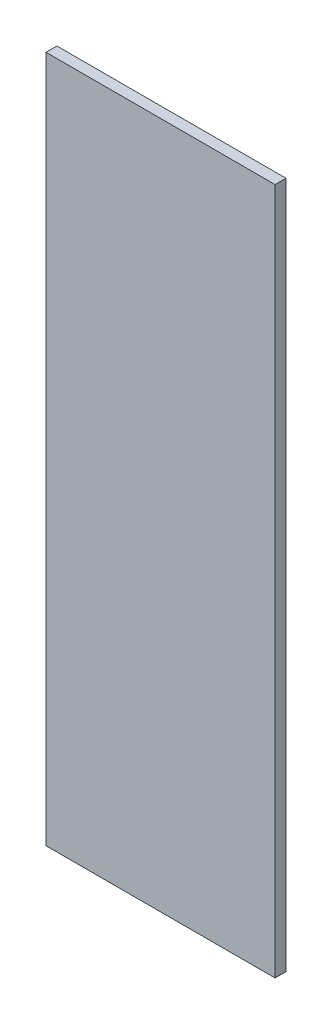
ISO-10303-21;
HEADER;
FILE_DESCRIPTION(('STEP AP214'),'2;1');
FILE_NAME('part.step','',(''),(''),'','','');
FILE_SCHEMA(('AUTOMOTIVE_DESIGN { 1 0 10303 214 1 1 1 1 }'));
ENDSEC;
DATA;
#1=APPLICATION_CONTEXT('core data for automotive mechanical design processes');
#2=APPLICATION_PROTOCOL_DEFINITION('international standard','automotive_design',2000,#1);
#3=PRODUCT_CONTEXT('',#1,'mechanical');
#4=PRODUCT('Part','Part','',(#3));
#5=PRODUCT_RELATED_PRODUCT_CATEGORY('part','',(#4));
#6=PRODUCT_DEFINITION_FORMATION('','',#4);
#7=PRODUCT_DEFINITION_CONTEXT('part definition',#1,'design');
#8=PRODUCT_DEFINITION('design','',#6,#7);
#9=PRODUCT_DEFINITION_SHAPE('','',#8);
#10=(LENGTH_UNIT() NAMED_UNIT(*) SI_UNIT(.MILLI.,.METRE.));
#11=(NAMED_UNIT(*) PLANE_ANGLE_UNIT() SI_UNIT($,.RADIAN.));
#12=(NAMED_UNIT(*) SI_UNIT($,.STERADIAN.) SOLID_ANGLE_UNIT());
#13=UNCERTAINTY_MEASURE_WITH_UNIT(LENGTH_MEASURE(1.E-05),#10,'distance_accuracy_value','');
#14=(GEOMETRIC_REPRESENTATION_CONTEXT(3) GLOBAL_UNCERTAINTY_ASSIGNED_CONTEXT((#13)) GLOBAL_UNIT_ASSIGNED_CONTEXT((#10,
#11,#12)) REPRESENTATION_CONTEXT('',''));
#15=CARTESIAN_POINT('',(0.,0.,0.));
#16=DIRECTION('',(0.,0.,1.));
#17=DIRECTION('',(1.,0.,0.));
#18=AXIS2_PLACEMENT_3D('',#15,#16,#17);
#19=CARTESIAN_POINT('',(-1.05,-3.834209469942,0.7));
#20=DIRECTION('',(-1.,0.,0.));
#21=DIRECTION('',(0.,1.,0.));
#22=AXIS2_PLACEMENT_3D('',#19,#20,#21);
#23=PLANE('',#22);
#24=DIRECTION('',(0.,0.,1.));
#25=VECTOR('',#24,1.);
#26=CARTESIAN_POINT('',(-1.05,-3.15,0.35));
#27=LINE('',#26,#25);
#28=CARTESIAN_POINT('',(-1.05,-3.15,0.6));
#29=VERTEX_POINT('',#28);
#30=CARTESIAN_POINT('',(-1.05,-3.15,0.7));
#31=VERTEX_POINT('',#30);
#32=EDGE_CURVE('E11',#29,#31,#27,.T.);
#33=ORIENTED_EDGE('',*,*,#32,.T.);
#34=DIRECTION('',(0.,1.,0.));
#35=VECTOR('',#34,1.);
#36=CARTESIAN_POINT('',(-1.05,-1.917104734971,0.7));
#37=LINE('',#36,#35);
#38=CARTESIAN_POINT('',(-1.05,3.15,0.7));
#39=VERTEX_POINT('',#38);
#40=EDGE_CURVE('E24',#31,#39,#37,.T.);
#41=ORIENTED_EDGE('',*,*,#40,.T.);
#42=DIRECTION('',(0.,0.,-1.));
#43=VECTOR('',#42,1.);
#44=CARTESIAN_POINT('',(-1.05,3.15,0.35));
#45=LINE('',#44,#43);
#46=CARTESIAN_POINT('',(-1.05,3.15,0.6));
#47=VERTEX_POINT('',#46);
#48=EDGE_CURVE('E75',#39,#47,#45,.T.);
#49=ORIENTED_EDGE('',*,*,#48,.T.);
#50=DIRECTION('',(0.,1.,0.));
#51=VECTOR('',#50,1.);
#52=CARTESIAN_POINT('',(-1.05,-3.834209469942,0.6));
#53=LINE('',#52,#51);
#54=EDGE_CURVE('E86',#29,#47,#53,.T.);
#55=ORIENTED_EDGE('',*,*,#54,.F.);
#56=EDGE_LOOP('',(#33,#41,#49,#55));
#57=FACE_BOUND('',#56,.T.);
#58=ADVANCED_FACE('F17',(#57),#23,.T.);
#59=CARTESIAN_POINT('',(1.05,3.834209469942,0.7));
#60=DIRECTION('',(1.,0.,0.));
#61=DIRECTION('',(0.,-1.,0.));
#62=AXIS2_PLACEMENT_3D('',#59,#60,#61);
#63=PLANE('',#62);
#64=DIRECTION('',(0.,0.,-1.));
#65=VECTOR('',#64,1.);
#66=CARTESIAN_POINT('',(1.05,-3.15,0.35));
#67=LINE('',#66,#65);
#68=CARTESIAN_POINT('',(1.05,-3.15,0.7));
#69=VERTEX_POINT('',#68);
#70=CARTESIAN_POINT('',(1.05,-3.15,0.6));
#71=VERTEX_POINT('',#70);
#72=EDGE_CURVE('E84',#69,#71,#67,.T.);
#73=ORIENTED_EDGE('',*,*,#72,.T.);
#74=DIRECTION('',(0.,-1.,0.));
#75=VECTOR('',#74,1.);
#76=CARTESIAN_POINT('',(1.05,3.834209469942,0.6));
#77=LINE('',#76,#75);
#78=CARTESIAN_POINT('',(1.05,3.15,0.6));
#79=VERTEX_POINT('',#78);
#80=EDGE_CURVE('E60',#79,#71,#77,.T.);
#81=ORIENTED_EDGE('',*,*,#80,.F.);
#82=DIRECTION('',(0.,0.,1.));
#83=VECTOR('',#82,1.);
#84=CARTESIAN_POINT('',(1.05,3.15,0.35));
#85=LINE('',#84,#83);
#86=CARTESIAN_POINT('',(1.05,3.15,0.7));
#87=VERTEX_POINT('',#86);
#88=EDGE_CURVE('E54',#79,#87,#85,.T.);
#89=ORIENTED_EDGE('',*,*,#88,.T.);
#90=DIRECTION('',(0.,-1.,0.));
#91=VECTOR('',#90,1.);
#92=CARTESIAN_POINT('',(1.05,1.917104734971,0.7));
#93=LINE('',#92,#91);
#94=EDGE_CURVE('E57',#87,#69,#93,.T.);
#95=ORIENTED_EDGE('',*,*,#94,.T.);
#96=EDGE_LOOP('',(#73,#81,#89,#95));
#97=FACE_BOUND('',#96,.T.);
#98=ADVANCED_FACE('F56',(#97),#63,.T.);
#99=CARTESIAN_POINT('',(0.,0.,0.6));
#100=DIRECTION('',(0.,0.,-1.));
#101=DIRECTION('',(-1.,0.,0.));
#102=AXIS2_PLACEMENT_3D('',#99,#100,#101);
#103=PLANE('',#102);
#104=DIRECTION('',(-1.,0.,0.));
#105=VECTOR('',#104,1.);
#106=CARTESIAN_POINT('',(-0.775,-3.15,0.6));
#107=LINE('',#106,#105);
#108=EDGE_CURVE('E71',#71,#29,#107,.T.);
#109=ORIENTED_EDGE('',*,*,#108,.T.);
#110=ORIENTED_EDGE('',*,*,#54,.T.);
#111=DIRECTION('',(1.,0.,0.));
#112=VECTOR('',#111,1.);
#113=CARTESIAN_POINT('',(0.775,3.15,0.6));
#114=LINE('',#113,#112);
#115=EDGE_CURVE('E77',#47,#79,#114,.T.);
#116=ORIENTED_EDGE('',*,*,#115,.T.);
#117=ORIENTED_EDGE('',*,*,#80,.T.);
#118=EDGE_LOOP('',(#109,#110,#116,#117));
#119=FACE_BOUND('',#118,.T.);
#120=ADVANCED_FACE('F91',(#119),#103,.T.);
#121=CARTESIAN_POINT('',(-1.55,-3.15,0.));
#122=DIRECTION('',(0.,-1.,0.));
#123=DIRECTION('',(1.,0.,0.));
#124=AXIS2_PLACEMENT_3D('',#121,#122,#123);
#125=PLANE('',#124);
#126=ORIENTED_EDGE('',*,*,#32,.F.);
#127=ORIENTED_EDGE('',*,*,#108,.F.);
#128=ORIENTED_EDGE('',*,*,#72,.F.);
#129=DIRECTION('',(1.,0.,0.));
#130=VECTOR('',#129,1.);
#131=CARTESIAN_POINT('',(-1.55,-3.15,0.7));
#132=LINE('',#131,#130);
#133=EDGE_CURVE('E70',#31,#69,#132,.T.);
#134=ORIENTED_EDGE('',*,*,#133,.F.);
#135=EDGE_LOOP('',(#126,#127,#128,#134));
#136=FACE_BOUND('',#135,.T.);
#137=ADVANCED_FACE('F89',(#136),#125,.T.);
#138=CARTESIAN_POINT('',(1.55,3.15,0.));
#139=DIRECTION('',(0.,1.,0.));
#140=DIRECTION('',(-1.,0.,0.));
#141=AXIS2_PLACEMENT_3D('',#138,#139,#140);
#142=PLANE('',#141);
#143=ORIENTED_EDGE('',*,*,#48,.F.);
#144=DIRECTION('',(-1.,0.,0.));
#145=VECTOR('',#144,1.);
#146=CARTESIAN_POINT('',(1.55,3.15,0.7));
#147=LINE('',#146,#145);
#148=EDGE_CURVE('E69',#87,#39,#147,.T.);
#149=ORIENTED_EDGE('',*,*,#148,.F.);
#150=ORIENTED_EDGE('',*,*,#88,.F.);
#151=ORIENTED_EDGE('',*,*,#115,.F.);
#152=EDGE_LOOP('',(#143,#149,#150,#151));
#153=FACE_BOUND('',#152,.T.);
#154=ADVANCED_FACE('F74',(#153),#142,.T.);
#155=CARTESIAN_POINT('',(0.,0.,0.7));
#156=DIRECTION('',(0.,0.,1.));
#157=DIRECTION('',(1.,0.,0.));
#158=AXIS2_PLACEMENT_3D('',#155,#156,#157);
#159=PLANE('',#158);
#160=ORIENTED_EDGE('',*,*,#40,.F.);
#161=ORIENTED_EDGE('',*,*,#133,.T.);
#162=ORIENTED_EDGE('',*,*,#94,.F.);
#163=ORIENTED_EDGE('',*,*,#148,.T.);
#164=EDGE_LOOP('',(#160,#161,#162,#163));
#165=FACE_BOUND('',#164,.T.);
#166=ADVANCED_FACE('F68',(#165),#159,.T.);
#167=CLOSED_SHELL('',(#58,#98,#120,#137,#154,#166));
#168=MANIFOLD_SOLID_BREP('B1',#167);
#169=ADVANCED_BREP_SHAPE_REPRESENTATION('',(#18,#168),#14);
#170=SHAPE_DEFINITION_REPRESENTATION(#9,#169);
ENDSEC;
END-ISO-10303-21;
